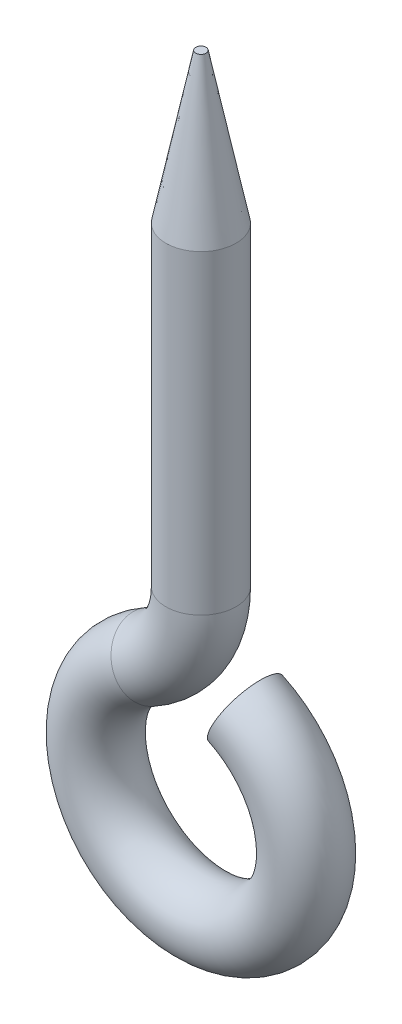
ISO-10303-21;
HEADER;
FILE_DESCRIPTION(('STEP AP214'),'2;1');
FILE_NAME('part.step','',(''),(''),'','','');
FILE_SCHEMA(('AUTOMOTIVE_DESIGN { 1 0 10303 214 1 1 1 1 }'));
ENDSEC;
DATA;
#1=APPLICATION_CONTEXT('core data for automotive mechanical design processes');
#2=APPLICATION_PROTOCOL_DEFINITION('international standard','automotive_design',2000,#1);
#3=PRODUCT_CONTEXT('',#1,'mechanical');
#4=PRODUCT('Part','Part','',(#3));
#5=PRODUCT_RELATED_PRODUCT_CATEGORY('part','',(#4));
#6=PRODUCT_DEFINITION_FORMATION('','',#4);
#7=PRODUCT_DEFINITION_CONTEXT('part definition',#1,'design');
#8=PRODUCT_DEFINITION('design','',#6,#7);
#9=PRODUCT_DEFINITION_SHAPE('','',#8);
#10=(LENGTH_UNIT() NAMED_UNIT(*) SI_UNIT(.MILLI.,.METRE.));
#11=(NAMED_UNIT(*) PLANE_ANGLE_UNIT() SI_UNIT($,.RADIAN.));
#12=(NAMED_UNIT(*) SI_UNIT($,.STERADIAN.) SOLID_ANGLE_UNIT());
#13=UNCERTAINTY_MEASURE_WITH_UNIT(LENGTH_MEASURE(1.E-05),#10,'distance_accuracy_value','');
#14=(GEOMETRIC_REPRESENTATION_CONTEXT(3) GLOBAL_UNCERTAINTY_ASSIGNED_CONTEXT((#13)) GLOBAL_UNIT_ASSIGNED_CONTEXT((#10,
#11,#12)) REPRESENTATION_CONTEXT('',''));
#15=CARTESIAN_POINT('',(0.,0.,0.));
#16=DIRECTION('',(0.,0.,1.));
#17=DIRECTION('',(1.,0.,0.));
#18=AXIS2_PLACEMENT_3D('',#15,#16,#17);
#19=CARTESIAN_POINT('',(0.,21.828125,0.));
#20=DIRECTION('',(0.,1.,0.));
#21=DIRECTION('',(0.,0.,1.));
#22=AXIS2_PLACEMENT_3D('',#19,#20,#21);
#23=PLANE('',#22);
#24=CARTESIAN_POINT('',(0.,21.828125,0.));
#25=DIRECTION('',(0.,1.,0.));
#26=DIRECTION('',(0.,0.,1.));
#27=AXIS2_PLACEMENT_3D('',#24,#25,#26);
#28=CIRCLE('',#27,0.174625000000015);
#29=CARTESIAN_POINT('',(0.,21.828125,-0.174625000000015));
#30=VERTEX_POINT('',#29);
#31=EDGE_CURVE('E44',#30,#30,#28,.T.);
#32=ORIENTED_EDGE('',*,*,#31,.T.);
#33=EDGE_LOOP('',(#32));
#34=FACE_BOUND('',#33,.T.);
#35=ADVANCED_FACE('F36',(#34),#23,.T.);
#36=CARTESIAN_POINT('',(1.50953960365506,3.23721812682153,0.));
#37=DIRECTION('',(0.906307787036649,-0.422618261740701,0.));
#38=DIRECTION('',(0.,0.,1.));
#39=AXIS2_PLACEMENT_3D('',#36,#37,#38);
#40=PLANE('',#39);
#41=CARTESIAN_POINT('',(1.50953960365506,3.23721812682153,0.));
#42=DIRECTION('',(0.906307787036649,-0.422618261740701,0.));
#43=DIRECTION('',(0.,0.,1.));
#44=AXIS2_PLACEMENT_3D('',#41,#42,#43);
#45=CIRCLE('',#44,1.190625);
#46=CARTESIAN_POINT('',(1.50953960365506,3.23721812682153,1.190625));
#47=VERTEX_POINT('',#46);
#48=EDGE_CURVE('E48',#47,#47,#45,.T.);
#49=ORIENTED_EDGE('',*,*,#48,.F.);
#50=EDGE_LOOP('',(#49));
#51=FACE_BOUND('',#50,.T.);
#52=ADVANCED_FACE('F74',(#51),#40,.F.);
#53=CARTESIAN_POINT('',(0.,21.828125,0.));
#54=DIRECTION('',(0.,-1.,0.));
#55=DIRECTION('',(0.,0.,-1.));
#56=AXIS2_PLACEMENT_3D('',#53,#54,#55);
#57=CYLINDRICAL_SURFACE('',#56,1.190625);
#58=CARTESIAN_POINT('',(0.,16.748125,0.));
#59=DIRECTION('',(0.,1.,0.));
#60=DIRECTION('',(0.,0.,1.));
#61=AXIS2_PLACEMENT_3D('',#58,#59,#60);
#62=CIRCLE('',#61,1.190625);
#63=CARTESIAN_POINT('',(0.,16.748125,-1.190625));
#64=VERTEX_POINT('',#63);
#65=EDGE_CURVE('E10',#64,#64,#62,.F.);
#66=ORIENTED_EDGE('',*,*,#65,.T.);
#67=EDGE_LOOP('',(#66));
#68=FACE_BOUND('',#67,.T.);
#69=CARTESIAN_POINT('',(0.,6.05937394748591,0.));
#70=DIRECTION('',(0.,1.,0.));
#71=DIRECTION('',(0.,0.,1.));
#72=AXIS2_PLACEMENT_3D('',#69,#70,#71);
#73=CIRCLE('',#72,1.190625);
#74=CARTESIAN_POINT('',(1.190625,6.0593739474859,0.));
#75=VERTEX_POINT('',#74);
#76=EDGE_CURVE('E57',#75,#75,#73,.T.);
#77=ORIENTED_EDGE('',*,*,#76,.T.);
#78=EDGE_LOOP('',(#77));
#79=FACE_BOUND('',#78,.T.);
#80=ADVANCED_FACE('F61',(#68,#79),#57,.T.);
#81=CARTESIAN_POINT('',(-3.35366181905105,6.05937394748591,0.));
#82=DIRECTION('',(0.,0.,-1.));
#83=DIRECTION('',(-1.,0.,0.));
#84=AXIS2_PLACEMENT_3D('',#81,#82,#83);
#85=TOROIDAL_SURFACE('',#84,3.35366181905105,1.190625);
#86=CARTESIAN_POINT('',(-1.72966531301531,3.12514782379596,0.));
#87=DIRECTION('',(0.87493202415985,0.484245756924671,0.));
#88=DIRECTION('',(0.,0.,1.));
#89=AXIS2_PLACEMENT_3D('',#86,#87,#88);
#90=CIRCLE('',#89,1.190625);
#91=CARTESIAN_POINT('',(-1.15311020867687,2.08343188253064,0.));
#92=VERTEX_POINT('',#91);
#93=EDGE_CURVE('E52',#92,#92,#90,.T.);
#94=CARTESIAN_POINT('',(-3.35366181905105,6.05937394748591,0.));
#95=DIRECTION('',(0.,0.,-1.));
#96=DIRECTION('',(-1.,0.,0.));
#97=AXIS2_PLACEMENT_3D('',#94,#95,#96);
#98=CIRCLE('',#97,4.54428681905105);
#99=EDGE_CURVE('',#75,#92,#98,.T.);
#100=ORIENTED_EDGE('',*,*,#76,.F.);
#101=ORIENTED_EDGE('',*,*,#93,.T.);
#102=ORIENTED_EDGE('',*,*,#99,.T.);
#103=ORIENTED_EDGE('',*,*,#99,.F.);
#104=EDGE_LOOP('',(#100,#102,#101,#103));
#105=FACE_BOUND('',#104,.T.);
#106=ADVANCED_FACE('F63',(#105),#85,.T.);
#107=CARTESIAN_POINT('',(0.,0.,0.));
#108=DIRECTION('',(0.,0.,1.));
#109=DIRECTION('',(1.,0.,0.));
#110=AXIS2_PLACEMENT_3D('',#107,#108,#109);
#111=TOROIDAL_SURFACE('',#110,3.571875,1.190625);
#112=ORIENTED_EDGE('',*,*,#48,.T.);
#113=EDGE_LOOP('',(#112));
#114=FACE_BOUND('',#113,.T.);
#115=ORIENTED_EDGE('',*,*,#93,.F.);
#116=EDGE_LOOP('',(#115));
#117=FACE_BOUND('',#116,.T.);
#118=ADVANCED_FACE('F65',(#114,#117),#111,.T.);
#119=CARTESIAN_POINT('',(0.,21.828125,0.));
#120=DIRECTION('',(0.,-1.,0.));
#121=DIRECTION('',(0.,0.,-1.));
#122=AXIS2_PLACEMENT_3D('',#119,#120,#121);
#123=CONICAL_SURFACE('',#122,0.174625000000015,0.197395559849877);
#124=CARTESIAN_POINT('',(0.,16.748125,-1.190625));
#125=CARTESIAN_POINT('',(0.,16.8010416666666,-1.18004166666667));
#126=CARTESIAN_POINT('',(0.,16.8539583333333,-1.16945833333333));
#127=CARTESIAN_POINT('',(0.,16.9597916666666,-1.14829166666667));
#128=CARTESIAN_POINT('',(0.,17.0127083333333,-1.13770833333333));
#129=CARTESIAN_POINT('',(0.,17.1185416666667,-1.11654166666667));
#130=CARTESIAN_POINT('',(0.,17.1714583333333,-1.10595833333333));
#131=CARTESIAN_POINT('',(0.,17.2772916666667,-1.08479166666667));
#132=CARTESIAN_POINT('',(0.,17.3302083333333,-1.07420833333334));
#133=CARTESIAN_POINT('',(0.,17.4360416666667,-1.05304166666667));
#134=CARTESIAN_POINT('',(0.,17.4889583333333,-1.04245833333334));
#135=CARTESIAN_POINT('',(0.,17.5947916666667,-1.02129166666667));
#136=CARTESIAN_POINT('',(0.,17.6477083333333,-1.01070833333334));
#137=CARTESIAN_POINT('',(0.,17.7535416666667,-0.98954166666667));
#138=CARTESIAN_POINT('',(0.,17.8064583333333,-0.978958333333337));
#139=CARTESIAN_POINT('',(0.,17.9122916666667,-0.95779166666667));
#140=CARTESIAN_POINT('',(0.,17.9652083333333,-0.947208333333337));
#141=CARTESIAN_POINT('',(0.,18.0710416666667,-0.926041666666671));
#142=CARTESIAN_POINT('',(0.,18.1239583333333,-0.915458333333338));
#143=CARTESIAN_POINT('',(0.,18.2297916666667,-0.894291666666671));
#144=CARTESIAN_POINT('',(0.,18.2827083333333,-0.883708333333338));
#145=CARTESIAN_POINT('',(0.,18.3885416666667,-0.862541666666672));
#146=CARTESIAN_POINT('',(0.,18.4414583333333,-0.851958333333339));
#147=CARTESIAN_POINT('',(0.,18.5472916666667,-0.830791666666672));
#148=CARTESIAN_POINT('',(0.,18.6002083333333,-0.820208333333339));
#149=CARTESIAN_POINT('',(0.,18.7060416666667,-0.799041666666673));
#150=CARTESIAN_POINT('',(0.,18.7589583333333,-0.788458333333339));
#151=CARTESIAN_POINT('',(0.,18.8647916666667,-0.767291666666673));
#152=CARTESIAN_POINT('',(0.,18.9177083333333,-0.75670833333334));
#153=CARTESIAN_POINT('',(0.,19.0235416666667,-0.735541666666674));
#154=CARTESIAN_POINT('',(0.,19.0764583333333,-0.724958333333341));
#155=CARTESIAN_POINT('',(0.,19.1822916666667,-0.703791666666674));
#156=CARTESIAN_POINT('',(0.,19.2352083333333,-0.693208333333341));
#157=CARTESIAN_POINT('',(0.,19.3410416666667,-0.672041666666675));
#158=CARTESIAN_POINT('',(0.,19.3939583333333,-0.661458333333342));
#159=CARTESIAN_POINT('',(0.,19.4997916666667,-0.640291666666675));
#160=CARTESIAN_POINT('',(0.,19.5527083333333,-0.629708333333342));
#161=CARTESIAN_POINT('',(0.,19.6585416666667,-0.608541666666676));
#162=CARTESIAN_POINT('',(0.,19.7114583333333,-0.597958333333343));
#163=CARTESIAN_POINT('',(0.,19.8172916666667,-0.576791666666676));
#164=CARTESIAN_POINT('',(0.,19.8702083333333,-0.566208333333343));
#165=CARTESIAN_POINT('',(0.,19.9760416666667,-0.545041666666676));
#166=CARTESIAN_POINT('',(0.,20.0289583333333,-0.534458333333343));
#167=CARTESIAN_POINT('',(0.,20.1347916666667,-0.513291666666677));
#168=CARTESIAN_POINT('',(0.,20.1877083333333,-0.502708333333344));
#169=CARTESIAN_POINT('',(0.,20.2935416666667,-0.481541666666678));
#170=CARTESIAN_POINT('',(0.,20.3464583333333,-0.470958333333344));
#171=CARTESIAN_POINT('',(0.,20.4522916666667,-0.449791666666678));
#172=CARTESIAN_POINT('',(0.,20.5052083333333,-0.439208333333345));
#173=CARTESIAN_POINT('',(0.,20.6110416666667,-0.418041666666679));
#174=CARTESIAN_POINT('',(0.,20.6639583333333,-0.407458333333345));
#175=CARTESIAN_POINT('',(0.,20.7697916666667,-0.386291666666679));
#176=CARTESIAN_POINT('',(0.,20.8227083333333,-0.375708333333346));
#177=CARTESIAN_POINT('',(0.,20.9285416666667,-0.354541666666679));
#178=CARTESIAN_POINT('',(0.,20.9814583333333,-0.343958333333346));
#179=CARTESIAN_POINT('',(0.,21.0872916666667,-0.32279166666668));
#180=CARTESIAN_POINT('',(0.,21.1402083333333,-0.312208333333347));
#181=CARTESIAN_POINT('',(0.,21.2460416666667,-0.29104166666668));
#182=CARTESIAN_POINT('',(0.,21.2989583333333,-0.280458333333347));
#183=CARTESIAN_POINT('',(0.,21.4047916666667,-0.259291666666681));
#184=CARTESIAN_POINT('',(0.,21.4577083333333,-0.248708333333348));
#185=CARTESIAN_POINT('',(0.,21.5635416666667,-0.227541666666681));
#186=CARTESIAN_POINT('',(0.,21.6164583333333,-0.216958333333348));
#187=CARTESIAN_POINT('',(0.,21.7222916666667,-0.195791666666682));
#188=CARTESIAN_POINT('',(0.,21.7752083333333,-0.185208333333349));
#189=CARTESIAN_POINT('',(0.,21.828125,-0.174625000000015));
#190=B_SPLINE_CURVE_WITH_KNOTS('',3,(#124,#125,#126,#127,#128,#129,#130,#131,#132,#133,#134,
#135,#136,#137,#138,#139,#140,#141,#142,#143,#144,#145,#146,#147,#148,#149,#150,#151,#152,#153,
#154,#155,#156,#157,#158,#159,#160,#161,#162,#163,#164,#165,#166,#167,#168,#169,#170,#171,#172,
#173,#174,#175,#176,#177,#178,#179,#180,#181,#182,#183,#184,#185,#186,#187,#188,#189),
.UNSPECIFIED.,.F.,.F.,(4,2,2,2,2,2,2,2,2,2,2,2,2,2,2,2,2,2,2,2,2,2,2,2,2,2,2,2,2,2,2,2,4),(0.,
0.161893869556573,0.323787739113143,0.485681608669717,0.647575478226287,0.809469347782857,
0.97136321733943,1.133257086896,1.29515095645257,1.45704482600914,1.61893869556571,
1.78083256512229,1.94272643467886,2.10462030423543,2.266514173792,2.42840804334857,
2.59030191290514,2.75219578246171,2.91408965201828,3.07598352157486,3.23787739113143,
3.399771260688,3.56166513024457,3.72355899980114,3.88545286935772,4.04734673891429,
4.20924060847085,4.37113447802742,4.533028347584,4.69492221714057,4.85681608669714,
5.01870995625371,5.18060382581028),.UNSPECIFIED.);
#191=EDGE_CURVE('BSEAM39',#64,#30,#190,.T.);
#192=ORIENTED_EDGE('',*,*,#65,.F.);
#193=ORIENTED_EDGE('',*,*,#31,.F.);
#194=ORIENTED_EDGE('',*,*,#191,.T.);
#195=ORIENTED_EDGE('',*,*,#191,.F.);
#196=EDGE_LOOP('',(#192,#194,#193,#195));
#197=FACE_BOUND('',#196,.T.);
#198=ADVANCED_FACE('F39',(#197),#123,.T.);
#199=CLOSED_SHELL('',(#35,#52,#80,#106,#118,#198));
#200=MANIFOLD_SOLID_BREP('B2',#199);
#201=ADVANCED_BREP_SHAPE_REPRESENTATION('',(#18,#200),#14);
#202=SHAPE_DEFINITION_REPRESENTATION(#9,#201);
ENDSEC;
END-ISO-10303-21;
